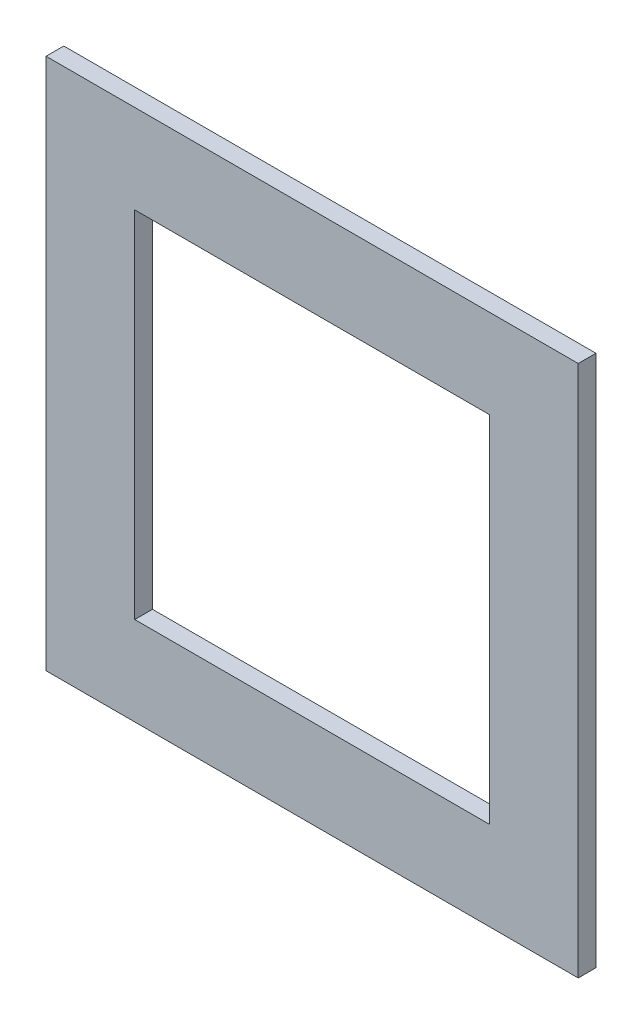
ISO-10303-21;
HEADER;
FILE_DESCRIPTION(('STEP AP214'),'2;1');
FILE_NAME('part.step','',(''),(''),'','','');
FILE_SCHEMA(('AUTOMOTIVE_DESIGN { 1 0 10303 214 1 1 1 1 }'));
ENDSEC;
DATA;
#1=APPLICATION_CONTEXT('core data for automotive mechanical design processes');
#2=APPLICATION_PROTOCOL_DEFINITION('international standard','automotive_design',2000,#1);
#3=PRODUCT_CONTEXT('',#1,'mechanical');
#4=PRODUCT('Part','Part','',(#3));
#5=PRODUCT_RELATED_PRODUCT_CATEGORY('part','',(#4));
#6=PRODUCT_DEFINITION_FORMATION('','',#4);
#7=PRODUCT_DEFINITION_CONTEXT('part definition',#1,'design');
#8=PRODUCT_DEFINITION('design','',#6,#7);
#9=PRODUCT_DEFINITION_SHAPE('','',#8);
#10=(LENGTH_UNIT() NAMED_UNIT(*) SI_UNIT(.MILLI.,.METRE.));
#11=(NAMED_UNIT(*) PLANE_ANGLE_UNIT() SI_UNIT($,.RADIAN.));
#12=(NAMED_UNIT(*) SI_UNIT($,.STERADIAN.) SOLID_ANGLE_UNIT());
#13=UNCERTAINTY_MEASURE_WITH_UNIT(LENGTH_MEASURE(1.E-05),#10,'distance_accuracy_value','');
#14=(GEOMETRIC_REPRESENTATION_CONTEXT(3) GLOBAL_UNCERTAINTY_ASSIGNED_CONTEXT((#13)) GLOBAL_UNIT_ASSIGNED_CONTEXT((#10,
#11,#12)) REPRESENTATION_CONTEXT('',''));
#15=CARTESIAN_POINT('',(0.,0.,0.));
#16=DIRECTION('',(0.,0.,1.));
#17=DIRECTION('',(1.,0.,0.));
#18=AXIS2_PLACEMENT_3D('',#15,#16,#17);
#19=CARTESIAN_POINT('',(0.,0.,10.));
#20=DIRECTION('',(0.,0.,-1.));
#21=DIRECTION('',(-1.,0.,0.));
#22=AXIS2_PLACEMENT_3D('',#19,#20,#21);
#23=PLANE('',#22);
#24=DIRECTION('',(0.,1.,0.));
#25=VECTOR('',#24,1.);
#26=CARTESIAN_POINT('',(150.,-150.,10.));
#27=LINE('',#26,#25);
#28=CARTESIAN_POINT('',(150.,-150.,10.));
#29=VERTEX_POINT('',#28);
#30=CARTESIAN_POINT('',(150.,150.,10.));
#31=VERTEX_POINT('',#30);
#32=EDGE_CURVE('E153',#29,#31,#27,.T.);
#33=ORIENTED_EDGE('',*,*,#32,.T.);
#34=DIRECTION('',(-1.,0.,0.));
#35=VECTOR('',#34,1.);
#36=CARTESIAN_POINT('',(-150.,150.,10.));
#37=LINE('',#36,#35);
#38=CARTESIAN_POINT('',(-150.,150.,10.));
#39=VERTEX_POINT('',#38);
#40=EDGE_CURVE('E157',#31,#39,#37,.T.);
#41=ORIENTED_EDGE('',*,*,#40,.T.);
#42=DIRECTION('',(0.,-1.,0.));
#43=VECTOR('',#42,1.);
#44=CARTESIAN_POINT('',(-150.,-150.,10.));
#45=LINE('',#44,#43);
#46=CARTESIAN_POINT('',(-150.,-150.,10.));
#47=VERTEX_POINT('',#46);
#48=EDGE_CURVE('E161',#39,#47,#45,.T.);
#49=ORIENTED_EDGE('',*,*,#48,.T.);
#50=DIRECTION('',(1.,0.,0.));
#51=VECTOR('',#50,1.);
#52=CARTESIAN_POINT('',(-150.,-150.,10.));
#53=LINE('',#52,#51);
#54=EDGE_CURVE('E164',#47,#29,#53,.T.);
#55=ORIENTED_EDGE('',*,*,#54,.T.);
#56=EDGE_LOOP('',(#33,#41,#49,#55));
#57=FACE_BOUND('',#56,.T.);
#58=DIRECTION('',(0.,1.,0.));
#59=VECTOR('',#58,1.);
#60=CARTESIAN_POINT('',(99.9999999999999,-100.,10.));
#61=LINE('',#60,#59);
#62=CARTESIAN_POINT('',(99.9999999999999,-100.,10.));
#63=VERTEX_POINT('',#62);
#64=CARTESIAN_POINT('',(99.9999999999999,100.,10.));
#65=VERTEX_POINT('',#64);
#66=EDGE_CURVE('E105',#63,#65,#61,.T.);
#67=ORIENTED_EDGE('',*,*,#66,.F.);
#68=DIRECTION('',(1.,0.,0.));
#69=VECTOR('',#68,1.);
#70=CARTESIAN_POINT('',(-100.,-100.,10.));
#71=LINE('',#70,#69);
#72=CARTESIAN_POINT('',(-100.,-100.,10.));
#73=VERTEX_POINT('',#72);
#74=EDGE_CURVE('E131',#73,#63,#71,.T.);
#75=ORIENTED_EDGE('',*,*,#74,.F.);
#76=DIRECTION('',(0.,-1.,0.));
#77=VECTOR('',#76,1.);
#78=CARTESIAN_POINT('',(-100.,-100.,10.));
#79=LINE('',#78,#77);
#80=CARTESIAN_POINT('',(-100.,100.,10.));
#81=VERTEX_POINT('',#80);
#82=EDGE_CURVE('E127',#81,#73,#79,.T.);
#83=ORIENTED_EDGE('',*,*,#82,.F.);
#84=DIRECTION('',(-1.,0.,0.));
#85=VECTOR('',#84,1.);
#86=CARTESIAN_POINT('',(-100.,100.,10.));
#87=LINE('',#86,#85);
#88=EDGE_CURVE('E114',#65,#81,#87,.T.);
#89=ORIENTED_EDGE('',*,*,#88,.F.);
#90=EDGE_LOOP('',(#67,#75,#83,#89));
#91=FACE_BOUND('',#90,.T.);
#92=ADVANCED_FACE('F39',(#57,#91),#23,.F.);
#93=CARTESIAN_POINT('',(0.,0.,0.));
#94=DIRECTION('',(0.,0.,-1.));
#95=DIRECTION('',(-1.,0.,0.));
#96=AXIS2_PLACEMENT_3D('',#93,#94,#95);
#97=PLANE('',#96);
#98=DIRECTION('',(0.,1.,0.));
#99=VECTOR('',#98,1.);
#100=CARTESIAN_POINT('',(150.,-150.,0.));
#101=LINE('',#100,#99);
#102=CARTESIAN_POINT('',(150.,-150.,0.));
#103=VERTEX_POINT('',#102);
#104=CARTESIAN_POINT('',(150.,150.,0.));
#105=VERTEX_POINT('',#104);
#106=EDGE_CURVE('E123',#103,#105,#101,.T.);
#107=ORIENTED_EDGE('',*,*,#106,.F.);
#108=DIRECTION('',(1.,0.,0.));
#109=VECTOR('',#108,1.);
#110=CARTESIAN_POINT('',(-150.,-150.,0.));
#111=LINE('',#110,#109);
#112=CARTESIAN_POINT('',(-150.,-150.,0.));
#113=VERTEX_POINT('',#112);
#114=EDGE_CURVE('E158',#113,#103,#111,.T.);
#115=ORIENTED_EDGE('',*,*,#114,.F.);
#116=DIRECTION('',(0.,-1.,0.));
#117=VECTOR('',#116,1.);
#118=CARTESIAN_POINT('',(-150.,-150.,0.));
#119=LINE('',#118,#117);
#120=CARTESIAN_POINT('',(-150.,150.,0.));
#121=VERTEX_POINT('',#120);
#122=EDGE_CURVE('E174',#121,#113,#119,.T.);
#123=ORIENTED_EDGE('',*,*,#122,.F.);
#124=DIRECTION('',(-1.,0.,0.));
#125=VECTOR('',#124,1.);
#126=CARTESIAN_POINT('',(-150.,150.,0.));
#127=LINE('',#126,#125);
#128=EDGE_CURVE('E171',#105,#121,#127,.T.);
#129=ORIENTED_EDGE('',*,*,#128,.F.);
#130=EDGE_LOOP('',(#107,#115,#123,#129));
#131=FACE_BOUND('',#130,.T.);
#132=DIRECTION('',(1.,0.,0.));
#133=VECTOR('',#132,1.);
#134=CARTESIAN_POINT('',(-100.,-100.,0.));
#135=LINE('',#134,#133);
#136=CARTESIAN_POINT('',(-100.,-100.,0.));
#137=VERTEX_POINT('',#136);
#138=CARTESIAN_POINT('',(99.9999999999999,-100.,0.));
#139=VERTEX_POINT('',#138);
#140=EDGE_CURVE('E115',#137,#139,#135,.T.);
#141=ORIENTED_EDGE('',*,*,#140,.T.);
#142=DIRECTION('',(0.,1.,0.));
#143=VECTOR('',#142,1.);
#144=CARTESIAN_POINT('',(99.9999999999999,-100.,0.));
#145=LINE('',#144,#143);
#146=CARTESIAN_POINT('',(99.9999999999999,100.,0.));
#147=VERTEX_POINT('',#146);
#148=EDGE_CURVE('E63',#139,#147,#145,.T.);
#149=ORIENTED_EDGE('',*,*,#148,.T.);
#150=DIRECTION('',(-1.,0.,0.));
#151=VECTOR('',#150,1.);
#152=CARTESIAN_POINT('',(-100.,100.,0.));
#153=LINE('',#152,#151);
#154=CARTESIAN_POINT('',(-100.,100.,0.));
#155=VERTEX_POINT('',#154);
#156=EDGE_CURVE('E121',#147,#155,#153,.T.);
#157=ORIENTED_EDGE('',*,*,#156,.T.);
#158=DIRECTION('',(0.,-1.,0.));
#159=VECTOR('',#158,1.);
#160=CARTESIAN_POINT('',(-100.,-100.,0.));
#161=LINE('',#160,#159);
#162=EDGE_CURVE('E140',#155,#137,#161,.T.);
#163=ORIENTED_EDGE('',*,*,#162,.T.);
#164=EDGE_LOOP('',(#141,#149,#157,#163));
#165=FACE_BOUND('',#164,.T.);
#166=ADVANCED_FACE('F197',(#131,#165),#97,.T.);
#167=CARTESIAN_POINT('',(150.,-150.,10.));
#168=DIRECTION('',(-1.,0.,0.));
#169=DIRECTION('',(0.,0.,1.));
#170=AXIS2_PLACEMENT_3D('',#167,#168,#169);
#171=PLANE('',#170);
#172=ORIENTED_EDGE('',*,*,#106,.T.);
#173=DIRECTION('',(0.,0.,-1.));
#174=VECTOR('',#173,1.);
#175=CARTESIAN_POINT('',(150.,150.,10.));
#176=LINE('',#175,#174);
#177=EDGE_CURVE('E11',#31,#105,#176,.T.);
#178=ORIENTED_EDGE('',*,*,#177,.F.);
#179=ORIENTED_EDGE('',*,*,#32,.F.);
#180=DIRECTION('',(0.,0.,-1.));
#181=VECTOR('',#180,1.);
#182=CARTESIAN_POINT('',(150.,-150.,10.));
#183=LINE('',#182,#181);
#184=EDGE_CURVE('E167',#29,#103,#183,.T.);
#185=ORIENTED_EDGE('',*,*,#184,.T.);
#186=EDGE_LOOP('',(#172,#178,#179,#185));
#187=FACE_BOUND('',#186,.T.);
#188=ADVANCED_FACE('F41',(#187),#171,.F.);
#189=CARTESIAN_POINT('',(-150.,150.,10.));
#190=DIRECTION('',(0.,-1.,0.));
#191=DIRECTION('',(0.,0.,-1.));
#192=AXIS2_PLACEMENT_3D('',#189,#190,#191);
#193=PLANE('',#192);
#194=ORIENTED_EDGE('',*,*,#128,.T.);
#195=DIRECTION('',(0.,0.,-1.));
#196=VECTOR('',#195,1.);
#197=CARTESIAN_POINT('',(-150.,150.,10.));
#198=LINE('',#197,#196);
#199=EDGE_CURVE('E48',#39,#121,#198,.T.);
#200=ORIENTED_EDGE('',*,*,#199,.F.);
#201=ORIENTED_EDGE('',*,*,#40,.F.);
#202=ORIENTED_EDGE('',*,*,#177,.T.);
#203=EDGE_LOOP('',(#194,#200,#201,#202));
#204=FACE_BOUND('',#203,.T.);
#205=ADVANCED_FACE('F207',(#204),#193,.F.);
#206=CARTESIAN_POINT('',(-150.,-150.,10.));
#207=DIRECTION('',(1.,0.,0.));
#208=DIRECTION('',(0.,0.,-1.));
#209=AXIS2_PLACEMENT_3D('',#206,#207,#208);
#210=PLANE('',#209);
#211=ORIENTED_EDGE('',*,*,#122,.T.);
#212=DIRECTION('',(0.,0.,-1.));
#213=VECTOR('',#212,1.);
#214=CARTESIAN_POINT('',(-150.,-150.,10.));
#215=LINE('',#214,#213);
#216=EDGE_CURVE('E182',#47,#113,#215,.T.);
#217=ORIENTED_EDGE('',*,*,#216,.F.);
#218=ORIENTED_EDGE('',*,*,#48,.F.);
#219=ORIENTED_EDGE('',*,*,#199,.T.);
#220=EDGE_LOOP('',(#211,#217,#218,#219));
#221=FACE_BOUND('',#220,.T.);
#222=ADVANCED_FACE('F191',(#221),#210,.F.);
#223=CARTESIAN_POINT('',(-150.,-150.,10.));
#224=DIRECTION('',(0.,1.,0.));
#225=DIRECTION('',(0.,0.,1.));
#226=AXIS2_PLACEMENT_3D('',#223,#224,#225);
#227=PLANE('',#226);
#228=ORIENTED_EDGE('',*,*,#114,.T.);
#229=ORIENTED_EDGE('',*,*,#184,.F.);
#230=ORIENTED_EDGE('',*,*,#54,.F.);
#231=ORIENTED_EDGE('',*,*,#216,.T.);
#232=EDGE_LOOP('',(#228,#229,#230,#231));
#233=FACE_BOUND('',#232,.T.);
#234=ADVANCED_FACE('F201',(#233),#227,.F.);
#235=CARTESIAN_POINT('',(99.9999999999999,-100.,10.));
#236=DIRECTION('',(-1.,0.,0.));
#237=DIRECTION('',(0.,0.,1.));
#238=AXIS2_PLACEMENT_3D('',#235,#236,#237);
#239=PLANE('',#238);
#240=ORIENTED_EDGE('',*,*,#148,.F.);
#241=DIRECTION('',(0.,0.,-1.));
#242=VECTOR('',#241,1.);
#243=CARTESIAN_POINT('',(99.9999999999999,-100.,10.));
#244=LINE('',#243,#242);
#245=EDGE_CURVE('E109',#63,#139,#244,.T.);
#246=ORIENTED_EDGE('',*,*,#245,.F.);
#247=ORIENTED_EDGE('',*,*,#66,.T.);
#248=DIRECTION('',(0.,0.,-1.));
#249=VECTOR('',#248,1.);
#250=CARTESIAN_POINT('',(99.9999999999999,100.,10.));
#251=LINE('',#250,#249);
#252=EDGE_CURVE('E108',#65,#147,#251,.T.);
#253=ORIENTED_EDGE('',*,*,#252,.T.);
#254=EDGE_LOOP('',(#240,#246,#247,#253));
#255=FACE_BOUND('',#254,.T.);
#256=ADVANCED_FACE('F107',(#255),#239,.T.);
#257=CARTESIAN_POINT('',(-100.,100.,10.));
#258=DIRECTION('',(0.,-1.,0.));
#259=DIRECTION('',(0.,0.,-1.));
#260=AXIS2_PLACEMENT_3D('',#257,#258,#259);
#261=PLANE('',#260);
#262=ORIENTED_EDGE('',*,*,#156,.F.);
#263=ORIENTED_EDGE('',*,*,#252,.F.);
#264=ORIENTED_EDGE('',*,*,#88,.T.);
#265=DIRECTION('',(0.,0.,-1.));
#266=VECTOR('',#265,1.);
#267=CARTESIAN_POINT('',(-100.,100.,10.));
#268=LINE('',#267,#266);
#269=EDGE_CURVE('E124',#81,#155,#268,.T.);
#270=ORIENTED_EDGE('',*,*,#269,.T.);
#271=EDGE_LOOP('',(#262,#263,#264,#270));
#272=FACE_BOUND('',#271,.T.);
#273=ADVANCED_FACE('F118',(#272),#261,.T.);
#274=CARTESIAN_POINT('',(-100.,-100.,10.));
#275=DIRECTION('',(1.,0.,0.));
#276=DIRECTION('',(0.,0.,-1.));
#277=AXIS2_PLACEMENT_3D('',#274,#275,#276);
#278=PLANE('',#277);
#279=ORIENTED_EDGE('',*,*,#162,.F.);
#280=ORIENTED_EDGE('',*,*,#269,.F.);
#281=ORIENTED_EDGE('',*,*,#82,.T.);
#282=DIRECTION('',(0.,0.,-1.));
#283=VECTOR('',#282,1.);
#284=CARTESIAN_POINT('',(-100.,-100.,10.));
#285=LINE('',#284,#283);
#286=EDGE_CURVE('E55',#73,#137,#285,.T.);
#287=ORIENTED_EDGE('',*,*,#286,.T.);
#288=EDGE_LOOP('',(#279,#280,#281,#287));
#289=FACE_BOUND('',#288,.T.);
#290=ADVANCED_FACE('F230',(#289),#278,.T.);
#291=CARTESIAN_POINT('',(-100.,-100.,10.));
#292=DIRECTION('',(0.,1.,0.));
#293=DIRECTION('',(0.,0.,1.));
#294=AXIS2_PLACEMENT_3D('',#291,#292,#293);
#295=PLANE('',#294);
#296=ORIENTED_EDGE('',*,*,#140,.F.);
#297=ORIENTED_EDGE('',*,*,#286,.F.);
#298=ORIENTED_EDGE('',*,*,#74,.T.);
#299=ORIENTED_EDGE('',*,*,#245,.T.);
#300=EDGE_LOOP('',(#296,#297,#298,#299));
#301=FACE_BOUND('',#300,.T.);
#302=ADVANCED_FACE('F234',(#301),#295,.T.);
#303=CLOSED_SHELL('',(#92,#166,#188,#205,#222,#234,#256,#273,#290,#302));
#304=MANIFOLD_SOLID_BREP('B2',#303);
#305=ADVANCED_BREP_SHAPE_REPRESENTATION('',(#18,#304),#14);
#306=SHAPE_DEFINITION_REPRESENTATION(#9,#305);
ENDSEC;
END-ISO-10303-21;
